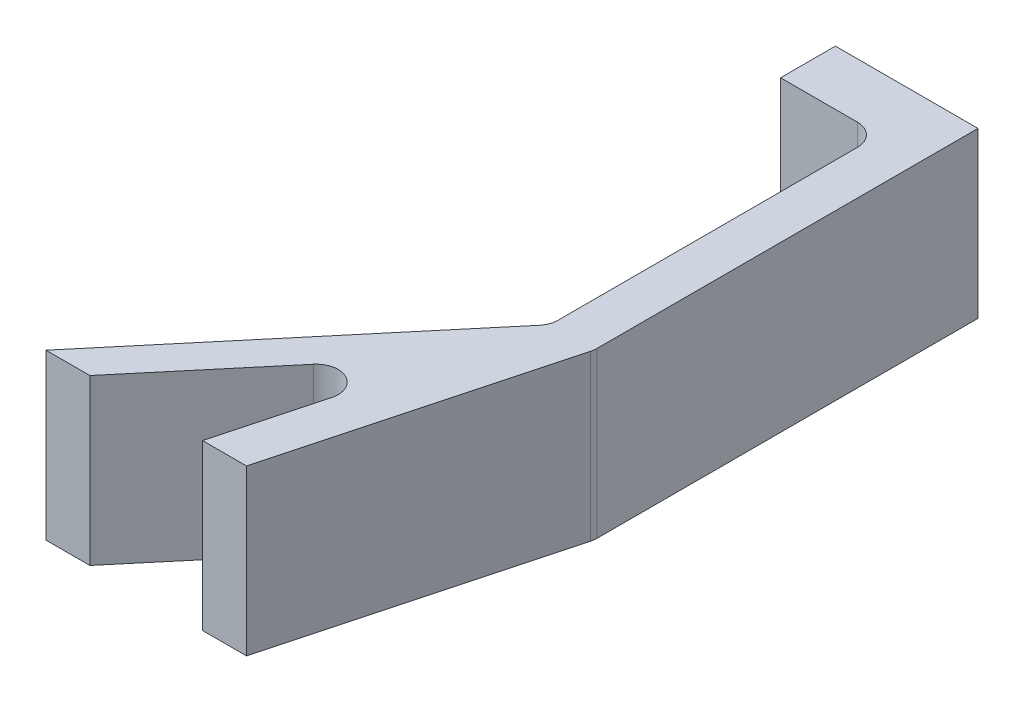
ISO-10303-21;
HEADER;
FILE_DESCRIPTION(('STEP AP214'),'2;1');
FILE_NAME('part.step','',(''),(''),'','','');
FILE_SCHEMA(('AUTOMOTIVE_DESIGN { 1 0 10303 214 1 1 1 1 }'));
ENDSEC;
DATA;
#1=APPLICATION_CONTEXT('core data for automotive mechanical design processes');
#2=APPLICATION_PROTOCOL_DEFINITION('international standard','automotive_design',2000,#1);
#3=PRODUCT_CONTEXT('',#1,'mechanical');
#4=PRODUCT('Part','Part','',(#3));
#5=PRODUCT_RELATED_PRODUCT_CATEGORY('part','',(#4));
#6=PRODUCT_DEFINITION_FORMATION('','',#4);
#7=PRODUCT_DEFINITION_CONTEXT('part definition',#1,'design');
#8=PRODUCT_DEFINITION('design','',#6,#7);
#9=PRODUCT_DEFINITION_SHAPE('','',#8);
#10=(LENGTH_UNIT() NAMED_UNIT(*) SI_UNIT(.MILLI.,.METRE.));
#11=(NAMED_UNIT(*) PLANE_ANGLE_UNIT() SI_UNIT($,.RADIAN.));
#12=(NAMED_UNIT(*) SI_UNIT($,.STERADIAN.) SOLID_ANGLE_UNIT());
#13=UNCERTAINTY_MEASURE_WITH_UNIT(LENGTH_MEASURE(1.E-05),#10,'distance_accuracy_value','');
#14=(GEOMETRIC_REPRESENTATION_CONTEXT(3) GLOBAL_UNCERTAINTY_ASSIGNED_CONTEXT((#13)) GLOBAL_UNIT_ASSIGNED_CONTEXT((#10,
#11,#12)) REPRESENTATION_CONTEXT('',''));
#15=CARTESIAN_POINT('',(0.,0.,0.));
#16=DIRECTION('',(0.,0.,1.));
#17=DIRECTION('',(1.,0.,0.));
#18=AXIS2_PLACEMENT_3D('',#15,#16,#17);
#19=CARTESIAN_POINT('',(-2.,15.,0.));
#20=DIRECTION('',(0.766044443118975,0.,0.642787609686544));
#21=DIRECTION('',(0.642787609686543,0.,-0.766044443118974));
#22=AXIS2_PLACEMENT_3D('',#19,#20,#21);
#23=PLANE('',#22);
#24=DIRECTION('',(-0.642787609686543,0.,0.766044443118975));
#25=VECTOR('',#24,1.);
#26=CARTESIAN_POINT('',(-2.,15.,0.));
#27=LINE('',#26,#25);
#28=CARTESIAN_POINT('',(-2.46791111376205,15.,0.557634750840676));
#29=VERTEX_POINT('',#28);
#30=CARTESIAN_POINT('',(-22.9774907794322,15.,25.));
#31=VERTEX_POINT('',#30);
#32=EDGE_CURVE('E138',#29,#31,#27,.T.);
#33=ORIENTED_EDGE('',*,*,#32,.F.);
#34=DIRECTION('',(0.,-1.,0.));
#35=VECTOR('',#34,1.);
#36=CARTESIAN_POINT('',(-2.46791111376205,0.,0.557634750840676));
#37=LINE('',#36,#35);
#38=CARTESIAN_POINT('',(-2.46791111376205,0.,0.557634750840676));
#39=VERTEX_POINT('',#38);
#40=EDGE_CURVE('E188',#29,#39,#37,.T.);
#41=ORIENTED_EDGE('',*,*,#40,.T.);
#42=DIRECTION('',(-0.642787609686543,0.,0.766044443118975));
#43=VECTOR('',#42,1.);
#44=CARTESIAN_POINT('',(-2.,0.,0.));
#45=LINE('',#44,#43);
#46=CARTESIAN_POINT('',(-22.9774907794322,0.,25.));
#47=VERTEX_POINT('',#46);
#48=EDGE_CURVE('E163',#39,#47,#45,.T.);
#49=ORIENTED_EDGE('',*,*,#48,.T.);
#50=DIRECTION('',(0.,-1.,0.));
#51=VECTOR('',#50,1.);
#52=CARTESIAN_POINT('',(-22.9774907794322,15.,25.));
#53=LINE('',#52,#51);
#54=EDGE_CURVE('E156',#31,#47,#53,.T.);
#55=ORIENTED_EDGE('',*,*,#54,.F.);
#56=EDGE_LOOP('',(#33,#41,#49,#55));
#57=FACE_BOUND('',#56,.T.);
#58=ADVANCED_FACE('F33',(#57),#23,.F.);
#59=CARTESIAN_POINT('',(-22.9774907794322,15.,25.));
#60=DIRECTION('',(0.,0.,-1.));
#61=DIRECTION('',(-1.,0.,0.));
#62=AXIS2_PLACEMENT_3D('',#59,#60,#61);
#63=PLANE('',#62);
#64=DIRECTION('',(1.,0.,0.));
#65=VECTOR('',#64,1.);
#66=CARTESIAN_POINT('',(-22.9774907794322,0.,25.));
#67=LINE('',#66,#65);
#68=CARTESIAN_POINT('',(-18.9774907794322,0.,25.));
#69=VERTEX_POINT('',#68);
#70=EDGE_CURVE('E232',#47,#69,#67,.T.);
#71=ORIENTED_EDGE('',*,*,#70,.T.);
#72=DIRECTION('',(0.,-1.,0.));
#73=VECTOR('',#72,1.);
#74=CARTESIAN_POINT('',(-18.9774907794322,15.,25.));
#75=LINE('',#74,#73);
#76=CARTESIAN_POINT('',(-18.9774907794322,15.,25.));
#77=VERTEX_POINT('',#76);
#78=EDGE_CURVE('E158',#77,#69,#75,.T.);
#79=ORIENTED_EDGE('',*,*,#78,.F.);
#80=DIRECTION('',(1.,0.,0.));
#81=VECTOR('',#80,1.);
#82=CARTESIAN_POINT('',(-22.9774907794322,15.,25.));
#83=LINE('',#82,#81);
#84=EDGE_CURVE('E143',#31,#77,#83,.T.);
#85=ORIENTED_EDGE('',*,*,#84,.F.);
#86=ORIENTED_EDGE('',*,*,#54,.T.);
#87=EDGE_LOOP('',(#71,#79,#85,#86));
#88=FACE_BOUND('',#87,.T.);
#89=ADVANCED_FACE('F155',(#88),#63,.F.);
#90=CARTESIAN_POINT('',(-3.87655772807841,15.,7.00340878452464));
#91=DIRECTION('',(-0.766044443118975,0.,-0.642787609686543));
#92=DIRECTION('',(-0.642787609686543,0.,0.766044443118975));
#93=AXIS2_PLACEMENT_3D('',#90,#91,#92);
#94=PLANE('',#93);
#95=DIRECTION('',(0.642787609686543,0.,-0.766044443118975));
#96=VECTOR('',#95,1.);
#97=CARTESIAN_POINT('',(-3.87655772807841,0.,7.00340878452464));
#98=LINE('',#97,#96);
#99=CARTESIAN_POINT('',(-9.67541280220174,0.,13.9142151520442));
#100=VERTEX_POINT('',#99);
#101=EDGE_CURVE('E234',#69,#100,#98,.T.);
#102=ORIENTED_EDGE('',*,*,#101,.T.);
#103=DIRECTION('',(0.,-1.,0.));
#104=VECTOR('',#103,1.);
#105=CARTESIAN_POINT('',(-9.67541280220174,15.,13.9142151520442));
#106=LINE('',#105,#104);
#107=CARTESIAN_POINT('',(-9.67541280220174,15.,13.9142151520442));
#108=VERTEX_POINT('',#107);
#109=EDGE_CURVE('E186',#100,#108,#106,.F.);
#110=ORIENTED_EDGE('',*,*,#109,.T.);
#111=DIRECTION('',(0.642787609686543,0.,-0.766044443118975));
#112=VECTOR('',#111,1.);
#113=CARTESIAN_POINT('',(-3.87655772807841,15.,7.00340878452464));
#114=LINE('',#113,#112);
#115=EDGE_CURVE('E160',#77,#108,#114,.T.);
#116=ORIENTED_EDGE('',*,*,#115,.F.);
#117=ORIENTED_EDGE('',*,*,#78,.T.);
#118=EDGE_LOOP('',(#102,#110,#116,#117));
#119=FACE_BOUND('',#118,.T.);
#120=ADVANCED_FACE('F311',(#119),#94,.F.);
#121=CARTESIAN_POINT('',(-3.87655772807841,15.,7.00340878452464));
#122=DIRECTION('',(0.965925826289068,0.,0.258819045102521));
#123=DIRECTION('',(0.258819045102521,0.,-0.965925826289068));
#124=AXIS2_PLACEMENT_3D('',#121,#122,#123);
#125=PLANE('',#124);
#126=DIRECTION('',(-0.258819045102521,0.,0.965925826289068));
#127=VECTOR('',#126,1.);
#128=CARTESIAN_POINT('',(-3.87655772807841,15.,7.00340878452464));
#129=LINE('',#128,#127);
#130=CARTESIAN_POINT('',(-6.21147226338566,15.,15.7174284616223));
#131=VERTEX_POINT('',#130);
#132=CARTESIAN_POINT('',(-8.69872981077808,15.,25.));
#133=VERTEX_POINT('',#132);
#134=EDGE_CURVE('E331',#131,#133,#129,.T.);
#135=ORIENTED_EDGE('',*,*,#134,.F.);
#136=DIRECTION('',(0.,-1.,0.));
#137=VECTOR('',#136,1.);
#138=CARTESIAN_POINT('',(-6.21147226338566,0.,15.7174284616223));
#139=LINE('',#138,#137);
#140=CARTESIAN_POINT('',(-6.21147226338566,0.,15.7174284616223));
#141=VERTEX_POINT('',#140);
#142=EDGE_CURVE('E183',#131,#141,#139,.T.);
#143=ORIENTED_EDGE('',*,*,#142,.T.);
#144=DIRECTION('',(-0.258819045102521,0.,0.965925826289068));
#145=VECTOR('',#144,1.);
#146=CARTESIAN_POINT('',(-3.87655772807841,0.,7.00340878452464));
#147=LINE('',#146,#145);
#148=CARTESIAN_POINT('',(-8.69872981077808,0.,25.));
#149=VERTEX_POINT('',#148);
#150=EDGE_CURVE('E237',#141,#149,#147,.T.);
#151=ORIENTED_EDGE('',*,*,#150,.T.);
#152=DIRECTION('',(0.,-1.,0.));
#153=VECTOR('',#152,1.);
#154=CARTESIAN_POINT('',(-8.69872981077808,15.,25.));
#155=LINE('',#154,#153);
#156=EDGE_CURVE('E170',#133,#149,#155,.T.);
#157=ORIENTED_EDGE('',*,*,#156,.F.);
#158=EDGE_LOOP('',(#135,#143,#151,#157));
#159=FACE_BOUND('',#158,.T.);
#160=ADVANCED_FACE('F335',(#159),#125,.F.);
#161=CARTESIAN_POINT('',(-8.69872981077808,15.,25.));
#162=DIRECTION('',(0.,0.,-1.));
#163=DIRECTION('',(-1.,0.,0.));
#164=AXIS2_PLACEMENT_3D('',#161,#162,#163);
#165=PLANE('',#164);
#166=DIRECTION('',(1.,0.,0.));
#167=VECTOR('',#166,1.);
#168=CARTESIAN_POINT('',(-8.69872981077808,0.,25.));
#169=LINE('',#168,#167);
#170=CARTESIAN_POINT('',(-4.69872981077808,0.,25.));
#171=VERTEX_POINT('',#170);
#172=EDGE_CURVE('E239',#149,#171,#169,.T.);
#173=ORIENTED_EDGE('',*,*,#172,.T.);
#174=DIRECTION('',(0.,-1.,0.));
#175=VECTOR('',#174,1.);
#176=CARTESIAN_POINT('',(-4.69872981077808,15.,25.));
#177=LINE('',#176,#175);
#178=CARTESIAN_POINT('',(-4.69872981077808,15.,25.));
#179=VERTEX_POINT('',#178);
#180=EDGE_CURVE('E255',#179,#171,#177,.T.);
#181=ORIENTED_EDGE('',*,*,#180,.F.);
#182=DIRECTION('',(1.,0.,0.));
#183=VECTOR('',#182,1.);
#184=CARTESIAN_POINT('',(-8.69872981077808,15.,25.));
#185=LINE('',#184,#183);
#186=EDGE_CURVE('E264',#133,#179,#185,.T.);
#187=ORIENTED_EDGE('',*,*,#186,.F.);
#188=ORIENTED_EDGE('',*,*,#156,.T.);
#189=EDGE_LOOP('',(#173,#181,#187,#188));
#190=FACE_BOUND('',#189,.T.);
#191=ADVANCED_FACE('F262',(#190),#165,.F.);
#192=CARTESIAN_POINT('',(2.,15.,0.));
#193=DIRECTION('',(-0.965925826289068,0.,-0.258819045102521));
#194=DIRECTION('',(-0.258819045102521,0.,0.965925826289068));
#195=AXIS2_PLACEMENT_3D('',#192,#193,#194);
#196=PLANE('',#195);
#197=DIRECTION('',(0.258819045102521,0.,-0.965925826289068));
#198=VECTOR('',#197,1.);
#199=CARTESIAN_POINT('',(2.,0.,0.));
#200=LINE('',#199,#198);
#201=CARTESIAN_POINT('',(1.93185165257813,0.,0.254333095030289));
#202=VERTEX_POINT('',#201);
#203=EDGE_CURVE('E241',#171,#202,#200,.T.);
#204=ORIENTED_EDGE('',*,*,#203,.T.);
#205=DIRECTION('',(0.,-1.,0.));
#206=VECTOR('',#205,1.);
#207=CARTESIAN_POINT('',(1.93185165257813,15.,0.254333095030289));
#208=LINE('',#207,#206);
#209=CARTESIAN_POINT('',(1.93185165257813,15.,0.254333095030289));
#210=VERTEX_POINT('',#209);
#211=EDGE_CURVE('E179',#202,#210,#208,.F.);
#212=ORIENTED_EDGE('',*,*,#211,.T.);
#213=DIRECTION('',(0.258819045102521,0.,-0.965925826289068));
#214=VECTOR('',#213,1.);
#215=CARTESIAN_POINT('',(2.,15.,0.));
#216=LINE('',#215,#214);
#217=EDGE_CURVE('E280',#179,#210,#216,.T.);
#218=ORIENTED_EDGE('',*,*,#217,.F.);
#219=ORIENTED_EDGE('',*,*,#180,.T.);
#220=EDGE_LOOP('',(#204,#212,#218,#219));
#221=FACE_BOUND('',#220,.T.);
#222=ADVANCED_FACE('F271',(#221),#196,.F.);
#223=CARTESIAN_POINT('',(2.,15.,-35.));
#224=DIRECTION('',(-1.,0.,0.));
#225=DIRECTION('',(0.,0.,1.));
#226=AXIS2_PLACEMENT_3D('',#223,#224,#225);
#227=PLANE('',#226);
#228=DIRECTION('',(0.,0.,-1.));
#229=VECTOR('',#228,1.);
#230=CARTESIAN_POINT('',(2.,15.,0.));
#231=LINE('',#230,#229);
#232=CARTESIAN_POINT('',(2.,15.,-0.263304995174753));
#233=VERTEX_POINT('',#232);
#234=CARTESIAN_POINT('',(2.,15.,-35.));
#235=VERTEX_POINT('',#234);
#236=EDGE_CURVE('E278',#233,#235,#231,.T.);
#237=ORIENTED_EDGE('',*,*,#236,.F.);
#238=DIRECTION('',(0.,-1.,0.));
#239=VECTOR('',#238,1.);
#240=CARTESIAN_POINT('',(1.99999999999999,15.,-0.263304995174754));
#241=LINE('',#240,#239);
#242=CARTESIAN_POINT('',(1.99999999999999,0.,-0.263304995174754));
#243=VERTEX_POINT('',#242);
#244=EDGE_CURVE('E165',#233,#243,#241,.T.);
#245=ORIENTED_EDGE('',*,*,#244,.T.);
#246=DIRECTION('',(0.,0.,-1.));
#247=VECTOR('',#246,1.);
#248=CARTESIAN_POINT('',(2.,0.,-35.));
#249=LINE('',#248,#247);
#250=CARTESIAN_POINT('',(2.,0.,-35.));
#251=VERTEX_POINT('',#250);
#252=EDGE_CURVE('E244',#243,#251,#249,.T.);
#253=ORIENTED_EDGE('',*,*,#252,.T.);
#254=DIRECTION('',(0.,-1.,0.));
#255=VECTOR('',#254,1.);
#256=CARTESIAN_POINT('',(2.,15.,-35.));
#257=LINE('',#256,#255);
#258=EDGE_CURVE('E252',#235,#251,#257,.T.);
#259=ORIENTED_EDGE('',*,*,#258,.F.);
#260=EDGE_LOOP('',(#237,#245,#253,#259));
#261=FACE_BOUND('',#260,.T.);
#262=ADVANCED_FACE('F282',(#261),#227,.F.);
#263=CARTESIAN_POINT('',(-11.,15.,-35.));
#264=DIRECTION('',(0.,0.,1.));
#265=DIRECTION('',(1.,0.,0.));
#266=AXIS2_PLACEMENT_3D('',#263,#264,#265);
#267=PLANE('',#266);
#268=CARTESIAN_POINT('',(-7.25,7.5,-35.));
#269=DIRECTION('',(0.,0.,-1.));
#270=DIRECTION('',(-1.,0.,0.));
#271=AXIS2_PLACEMENT_3D('',#268,#269,#270);
#272=CIRCLE('',#271,1.6);
#273=CARTESIAN_POINT('',(-8.85,7.5,-35.));
#274=VERTEX_POINT('',#273);
#275=EDGE_CURVE('E176',#274,#274,#272,.T.);
#276=ORIENTED_EDGE('',*,*,#275,.F.);
#277=EDGE_LOOP('',(#276));
#278=FACE_BOUND('',#277,.T.);
#279=DIRECTION('',(-1.,0.,0.));
#280=VECTOR('',#279,1.);
#281=CARTESIAN_POINT('',(-11.,0.,-35.));
#282=LINE('',#281,#280);
#283=CARTESIAN_POINT('',(-11.,0.,-35.));
#284=VERTEX_POINT('',#283);
#285=EDGE_CURVE('E246',#251,#284,#282,.T.);
#286=ORIENTED_EDGE('',*,*,#285,.T.);
#287=DIRECTION('',(0.,-1.,0.));
#288=VECTOR('',#287,1.);
#289=CARTESIAN_POINT('',(-11.,15.,-35.));
#290=LINE('',#289,#288);
#291=CARTESIAN_POINT('',(-11.,15.,-35.));
#292=VERTEX_POINT('',#291);
#293=EDGE_CURVE('E225',#292,#284,#290,.T.);
#294=ORIENTED_EDGE('',*,*,#293,.F.);
#295=DIRECTION('',(-1.,0.,0.));
#296=VECTOR('',#295,1.);
#297=CARTESIAN_POINT('',(-11.,15.,-35.));
#298=LINE('',#297,#296);
#299=EDGE_CURVE('E284',#235,#292,#298,.T.);
#300=ORIENTED_EDGE('',*,*,#299,.F.);
#301=ORIENTED_EDGE('',*,*,#258,.T.);
#302=EDGE_LOOP('',(#286,#294,#300,#301));
#303=FACE_BOUND('',#302,.T.);
#304=ADVANCED_FACE('F295',(#278,#303),#267,.F.);
#305=CARTESIAN_POINT('',(-11.,15.,-30.));
#306=DIRECTION('',(1.,0.,0.));
#307=DIRECTION('',(0.,0.,-1.));
#308=AXIS2_PLACEMENT_3D('',#305,#306,#307);
#309=PLANE('',#308);
#310=DIRECTION('',(0.,0.,1.));
#311=VECTOR('',#310,1.);
#312=CARTESIAN_POINT('',(-11.,0.,-30.));
#313=LINE('',#312,#311);
#314=CARTESIAN_POINT('',(-11.,0.,-30.));
#315=VERTEX_POINT('',#314);
#316=EDGE_CURVE('E219',#284,#315,#313,.T.);
#317=ORIENTED_EDGE('',*,*,#316,.T.);
#318=DIRECTION('',(0.,-1.,0.));
#319=VECTOR('',#318,1.);
#320=CARTESIAN_POINT('',(-11.,15.,-30.));
#321=LINE('',#320,#319);
#322=CARTESIAN_POINT('',(-11.,15.,-30.));
#323=VERTEX_POINT('',#322);
#324=EDGE_CURVE('E218',#323,#315,#321,.T.);
#325=ORIENTED_EDGE('',*,*,#324,.F.);
#326=DIRECTION('',(0.,0.,1.));
#327=VECTOR('',#326,1.);
#328=CARTESIAN_POINT('',(-11.,15.,-30.));
#329=LINE('',#328,#327);
#330=EDGE_CURVE('E227',#292,#323,#329,.T.);
#331=ORIENTED_EDGE('',*,*,#330,.F.);
#332=ORIENTED_EDGE('',*,*,#293,.T.);
#333=EDGE_LOOP('',(#317,#325,#331,#332));
#334=FACE_BOUND('',#333,.T.);
#335=ADVANCED_FACE('F292',(#334),#309,.F.);
#336=CARTESIAN_POINT('',(-2.,15.,-30.));
#337=DIRECTION('',(0.,0.,-1.));
#338=DIRECTION('',(-1.,0.,0.));
#339=AXIS2_PLACEMENT_3D('',#336,#337,#338);
#340=PLANE('',#339);
#341=CARTESIAN_POINT('',(-7.25,7.5,-30.));
#342=DIRECTION('',(0.,0.,-1.));
#343=DIRECTION('',(-1.,0.,0.));
#344=AXIS2_PLACEMENT_3D('',#341,#342,#343);
#345=CIRCLE('',#344,1.6);
#346=CARTESIAN_POINT('',(-8.85,7.5,-30.));
#347=VERTEX_POINT('',#346);
#348=EDGE_CURVE('E174',#347,#347,#345,.T.);
#349=ORIENTED_EDGE('',*,*,#348,.T.);
#350=EDGE_LOOP('',(#349));
#351=FACE_BOUND('',#350,.T.);
#352=DIRECTION('',(1.,0.,0.));
#353=VECTOR('',#352,1.);
#354=CARTESIAN_POINT('',(-2.,0.,-30.));
#355=LINE('',#354,#353);
#356=CARTESIAN_POINT('',(-4.,0.,-30.));
#357=VERTEX_POINT('',#356);
#358=EDGE_CURVE('E209',#315,#357,#355,.T.);
#359=ORIENTED_EDGE('',*,*,#358,.T.);
#360=DIRECTION('',(0.,-1.,0.));
#361=VECTOR('',#360,1.);
#362=CARTESIAN_POINT('',(-4.,15.,-30.));
#363=LINE('',#362,#361);
#364=CARTESIAN_POINT('',(-4.,15.,-30.));
#365=VERTEX_POINT('',#364);
#366=EDGE_CURVE('E194',#357,#365,#363,.F.);
#367=ORIENTED_EDGE('',*,*,#366,.T.);
#368=DIRECTION('',(1.,0.,0.));
#369=VECTOR('',#368,1.);
#370=CARTESIAN_POINT('',(-2.,15.,-30.));
#371=LINE('',#370,#369);
#372=EDGE_CURVE('E223',#323,#365,#371,.T.);
#373=ORIENTED_EDGE('',*,*,#372,.F.);
#374=ORIENTED_EDGE('',*,*,#324,.T.);
#375=EDGE_LOOP('',(#359,#367,#373,#374));
#376=FACE_BOUND('',#375,.T.);
#377=ADVANCED_FACE('F215',(#351,#376),#340,.F.);
#378=CARTESIAN_POINT('',(-2.,15.,0.));
#379=DIRECTION('',(1.,0.,0.));
#380=DIRECTION('',(0.,0.,-1.));
#381=AXIS2_PLACEMENT_3D('',#378,#379,#380);
#382=PLANE('',#381);
#383=DIRECTION('',(0.,0.,1.));
#384=VECTOR('',#383,1.);
#385=CARTESIAN_POINT('',(-2.,0.,0.));
#386=LINE('',#385,#384);
#387=CARTESIAN_POINT('',(-2.,0.,-28.));
#388=VERTEX_POINT('',#387);
#389=CARTESIAN_POINT('',(-2.,0.,-0.727940468532411));
#390=VERTEX_POINT('',#389);
#391=EDGE_CURVE('E151',#388,#390,#386,.T.);
#392=ORIENTED_EDGE('',*,*,#391,.T.);
#393=DIRECTION('',(0.,-1.,0.));
#394=VECTOR('',#393,1.);
#395=CARTESIAN_POINT('',(-2.,15.,-0.727940468532411));
#396=LINE('',#395,#394);
#397=CARTESIAN_POINT('',(-2.,15.,-0.727940468532411));
#398=VERTEX_POINT('',#397);
#399=EDGE_CURVE('E48',#390,#398,#396,.F.);
#400=ORIENTED_EDGE('',*,*,#399,.T.);
#401=DIRECTION('',(0.,0.,1.));
#402=VECTOR('',#401,1.);
#403=CARTESIAN_POINT('',(-2.,15.,0.));
#404=LINE('',#403,#402);
#405=CARTESIAN_POINT('',(-2.,15.,-28.));
#406=VERTEX_POINT('',#405);
#407=EDGE_CURVE('E222',#406,#398,#404,.T.);
#408=ORIENTED_EDGE('',*,*,#407,.F.);
#409=DIRECTION('',(0.,-1.,0.));
#410=VECTOR('',#409,1.);
#411=CARTESIAN_POINT('',(-2.,0.,-28.));
#412=LINE('',#411,#410);
#413=EDGE_CURVE('E190',#406,#388,#412,.T.);
#414=ORIENTED_EDGE('',*,*,#413,.T.);
#415=EDGE_LOOP('',(#392,#400,#408,#414));
#416=FACE_BOUND('',#415,.T.);
#417=ADVANCED_FACE('F221',(#416),#382,.F.);
#418=CARTESIAN_POINT('',(0.,15.,0.));
#419=DIRECTION('',(0.,1.,0.));
#420=DIRECTION('',(0.,0.,1.));
#421=AXIS2_PLACEMENT_3D('',#418,#419,#420);
#422=PLANE('',#421);
#423=ORIENTED_EDGE('',*,*,#217,.T.);
#424=CARTESIAN_POINT('',(0.,15.,-0.263304995174754));
#425=DIRECTION('',(0.,1.,0.));
#426=DIRECTION('',(0.,0.,1.));
#427=AXIS2_PLACEMENT_3D('',#424,#425,#426);
#428=CIRCLE('',#427,2.);
#429=EDGE_CURVE('E181',#210,#233,#428,.T.);
#430=ORIENTED_EDGE('',*,*,#429,.T.);
#431=ORIENTED_EDGE('',*,*,#236,.T.);
#432=ORIENTED_EDGE('',*,*,#299,.T.);
#433=ORIENTED_EDGE('',*,*,#330,.T.);
#434=ORIENTED_EDGE('',*,*,#372,.T.);
#435=CARTESIAN_POINT('',(-4.,15.,-28.));
#436=DIRECTION('',(0.,1.,0.));
#437=DIRECTION('',(0.,0.,1.));
#438=AXIS2_PLACEMENT_3D('',#435,#436,#437);
#439=CIRCLE('',#438,2.);
#440=EDGE_CURVE('E11',#365,#406,#439,.F.);
#441=ORIENTED_EDGE('',*,*,#440,.T.);
#442=ORIENTED_EDGE('',*,*,#407,.T.);
#443=CARTESIAN_POINT('',(-4.,15.,-0.727940468532411));
#444=DIRECTION('',(0.,1.,0.));
#445=DIRECTION('',(0.,0.,1.));
#446=AXIS2_PLACEMENT_3D('',#443,#444,#445);
#447=CIRCLE('',#446,2.);
#448=EDGE_CURVE('E146',#398,#29,#447,.F.);
#449=ORIENTED_EDGE('',*,*,#448,.T.);
#450=ORIENTED_EDGE('',*,*,#32,.T.);
#451=ORIENTED_EDGE('',*,*,#84,.T.);
#452=ORIENTED_EDGE('',*,*,#115,.T.);
#453=CARTESIAN_POINT('',(-8.1433239159638,15.,15.1997903714173));
#454=DIRECTION('',(0.,1.,0.));
#455=DIRECTION('',(0.,0.,1.));
#456=AXIS2_PLACEMENT_3D('',#453,#454,#455);
#457=CIRCLE('',#456,2.);
#458=EDGE_CURVE('E198',#108,#131,#457,.F.);
#459=ORIENTED_EDGE('',*,*,#458,.T.);
#460=ORIENTED_EDGE('',*,*,#134,.T.);
#461=ORIENTED_EDGE('',*,*,#186,.T.);
#462=EDGE_LOOP('',(#423,#430,#431,#432,#433,#434,#441,#442,#449,#450,#451,#452,#459,#460,#461));
#463=FACE_BOUND('',#462,.T.);
#464=ADVANCED_FACE('F141',(#463),#422,.T.);
#465=CARTESIAN_POINT('',(0.,0.,0.));
#466=DIRECTION('',(0.,1.,0.));
#467=DIRECTION('',(0.,0.,1.));
#468=AXIS2_PLACEMENT_3D('',#465,#466,#467);
#469=PLANE('',#468);
#470=ORIENTED_EDGE('',*,*,#252,.F.);
#471=CARTESIAN_POINT('',(0.,0.,-0.263304995174754));
#472=DIRECTION('',(0.,1.,0.));
#473=DIRECTION('',(0.,0.,1.));
#474=AXIS2_PLACEMENT_3D('',#471,#472,#473);
#475=CIRCLE('',#474,2.);
#476=EDGE_CURVE('E168',#243,#202,#475,.F.);
#477=ORIENTED_EDGE('',*,*,#476,.T.);
#478=ORIENTED_EDGE('',*,*,#203,.F.);
#479=ORIENTED_EDGE('',*,*,#172,.F.);
#480=ORIENTED_EDGE('',*,*,#150,.F.);
#481=CARTESIAN_POINT('',(-8.1433239159638,0.,15.1997903714173));
#482=DIRECTION('',(0.,1.,0.));
#483=DIRECTION('',(0.,0.,1.));
#484=AXIS2_PLACEMENT_3D('',#481,#482,#483);
#485=CIRCLE('',#484,2.);
#486=EDGE_CURVE('E196',#141,#100,#485,.T.);
#487=ORIENTED_EDGE('',*,*,#486,.T.);
#488=ORIENTED_EDGE('',*,*,#101,.F.);
#489=ORIENTED_EDGE('',*,*,#70,.F.);
#490=ORIENTED_EDGE('',*,*,#48,.F.);
#491=CARTESIAN_POINT('',(-4.,0.,-0.727940468532411));
#492=DIRECTION('',(0.,1.,0.));
#493=DIRECTION('',(0.,0.,1.));
#494=AXIS2_PLACEMENT_3D('',#491,#492,#493);
#495=CIRCLE('',#494,2.);
#496=EDGE_CURVE('E200',#39,#390,#495,.T.);
#497=ORIENTED_EDGE('',*,*,#496,.T.);
#498=ORIENTED_EDGE('',*,*,#391,.F.);
#499=CARTESIAN_POINT('',(-4.,0.,-28.));
#500=DIRECTION('',(0.,1.,0.));
#501=DIRECTION('',(0.,0.,1.));
#502=AXIS2_PLACEMENT_3D('',#499,#500,#501);
#503=CIRCLE('',#502,2.);
#504=EDGE_CURVE('E41',#388,#357,#503,.T.);
#505=ORIENTED_EDGE('',*,*,#504,.T.);
#506=ORIENTED_EDGE('',*,*,#358,.F.);
#507=ORIENTED_EDGE('',*,*,#316,.F.);
#508=ORIENTED_EDGE('',*,*,#285,.F.);
#509=EDGE_LOOP('',(#470,#477,#478,#479,#480,#487,#488,#489,#490,#497,#498,#505,#506,#507,#508));
#510=FACE_BOUND('',#509,.T.);
#511=ADVANCED_FACE('F207',(#510),#469,.F.);
#512=CARTESIAN_POINT('',(-7.25,7.5,-25.));
#513=DIRECTION('',(0.,0.,-1.));
#514=DIRECTION('',(-1.,0.,0.));
#515=AXIS2_PLACEMENT_3D('',#512,#513,#514);
#516=CYLINDRICAL_SURFACE('',#515,1.6);
#517=ORIENTED_EDGE('',*,*,#275,.T.);
#518=EDGE_LOOP('',(#517));
#519=FACE_BOUND('',#518,.T.);
#520=ORIENTED_EDGE('',*,*,#348,.F.);
#521=EDGE_LOOP('',(#520));
#522=FACE_BOUND('',#521,.T.);
#523=ADVANCED_FACE('F318',(#519,#522),#516,.F.);
#524=CARTESIAN_POINT('',(0.,15.,-0.263304995174754));
#525=DIRECTION('',(0.,-1.,0.));
#526=DIRECTION('',(0.,0.,-1.));
#527=AXIS2_PLACEMENT_3D('',#524,#525,#526);
#528=CYLINDRICAL_SURFACE('',#527,2.);
#529=ORIENTED_EDGE('',*,*,#429,.F.);
#530=ORIENTED_EDGE('',*,*,#211,.F.);
#531=ORIENTED_EDGE('',*,*,#476,.F.);
#532=ORIENTED_EDGE('',*,*,#244,.F.);
#533=EDGE_LOOP('',(#529,#530,#531,#532));
#534=FACE_BOUND('',#533,.T.);
#535=ADVANCED_FACE('F275',(#534),#528,.T.);
#536=CARTESIAN_POINT('',(-8.1433239159638,15.,15.1997903714173));
#537=DIRECTION('',(0.,1.,0.));
#538=DIRECTION('',(0.,0.,1.));
#539=AXIS2_PLACEMENT_3D('',#536,#537,#538);
#540=CYLINDRICAL_SURFACE('',#539,2.);
#541=ORIENTED_EDGE('',*,*,#458,.F.);
#542=ORIENTED_EDGE('',*,*,#109,.F.);
#543=ORIENTED_EDGE('',*,*,#486,.F.);
#544=ORIENTED_EDGE('',*,*,#142,.F.);
#545=EDGE_LOOP('',(#541,#542,#543,#544));
#546=FACE_BOUND('',#545,.T.);
#547=ADVANCED_FACE('F317',(#546),#540,.F.);
#548=CARTESIAN_POINT('',(-4.,15.,-0.727940468532411));
#549=DIRECTION('',(0.,1.,0.));
#550=DIRECTION('',(0.,0.,1.));
#551=AXIS2_PLACEMENT_3D('',#548,#549,#550);
#552=CYLINDRICAL_SURFACE('',#551,2.);
#553=ORIENTED_EDGE('',*,*,#448,.F.);
#554=ORIENTED_EDGE('',*,*,#399,.F.);
#555=ORIENTED_EDGE('',*,*,#496,.F.);
#556=ORIENTED_EDGE('',*,*,#40,.F.);
#557=EDGE_LOOP('',(#553,#554,#555,#556));
#558=FACE_BOUND('',#557,.T.);
#559=ADVANCED_FACE('F320',(#558),#552,.F.);
#560=CARTESIAN_POINT('',(-4.,15.,-28.));
#561=DIRECTION('',(0.,1.,0.));
#562=DIRECTION('',(0.,0.,1.));
#563=AXIS2_PLACEMENT_3D('',#560,#561,#562);
#564=CYLINDRICAL_SURFACE('',#563,2.);
#565=ORIENTED_EDGE('',*,*,#440,.F.);
#566=ORIENTED_EDGE('',*,*,#366,.F.);
#567=ORIENTED_EDGE('',*,*,#504,.F.);
#568=ORIENTED_EDGE('',*,*,#413,.F.);
#569=EDGE_LOOP('',(#565,#566,#567,#568));
#570=FACE_BOUND('',#569,.T.);
#571=ADVANCED_FACE('F35',(#570),#564,.F.);
#572=CLOSED_SHELL('',(#58,#89,#120,#160,#191,#222,#262,#304,#335,#377,#417,#464,#511,#523,#535,
#547,#559,#571));
#573=MANIFOLD_SOLID_BREP('B2',#572);
#574=ADVANCED_BREP_SHAPE_REPRESENTATION('',(#18,#573),#14);
#575=SHAPE_DEFINITION_REPRESENTATION(#9,#574);
ENDSEC;
END-ISO-10303-21;
